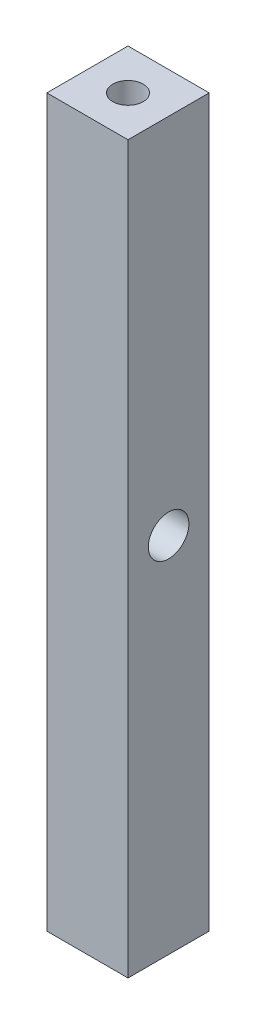
ISO-10303-21;
HEADER;
FILE_DESCRIPTION(('STEP AP214'),'2;1');
FILE_NAME('part.step','',(''),(''),'','','');
FILE_SCHEMA(('AUTOMOTIVE_DESIGN { 1 0 10303 214 1 1 1 1 }'));
ENDSEC;
DATA;
#1=APPLICATION_CONTEXT('core data for automotive mechanical design processes');
#2=APPLICATION_PROTOCOL_DEFINITION('international standard','automotive_design',2000,#1);
#3=PRODUCT_CONTEXT('',#1,'mechanical');
#4=PRODUCT('Part','Part','',(#3));
#5=PRODUCT_RELATED_PRODUCT_CATEGORY('part','',(#4));
#6=PRODUCT_DEFINITION_FORMATION('','',#4);
#7=PRODUCT_DEFINITION_CONTEXT('part definition',#1,'design');
#8=PRODUCT_DEFINITION('design','',#6,#7);
#9=PRODUCT_DEFINITION_SHAPE('','',#8);
#10=(LENGTH_UNIT() NAMED_UNIT(*) SI_UNIT(.MILLI.,.METRE.));
#11=(NAMED_UNIT(*) PLANE_ANGLE_UNIT() SI_UNIT($,.RADIAN.));
#12=(NAMED_UNIT(*) SI_UNIT($,.STERADIAN.) SOLID_ANGLE_UNIT());
#13=UNCERTAINTY_MEASURE_WITH_UNIT(LENGTH_MEASURE(1.E-05),#10,'distance_accuracy_value','');
#14=(GEOMETRIC_REPRESENTATION_CONTEXT(3) GLOBAL_UNCERTAINTY_ASSIGNED_CONTEXT((#13)) GLOBAL_UNIT_ASSIGNED_CONTEXT((#10,
#11,#12)) REPRESENTATION_CONTEXT('',''));
#15=CARTESIAN_POINT('',(0.,0.,0.));
#16=DIRECTION('',(0.,0.,1.));
#17=DIRECTION('',(1.,0.,0.));
#18=AXIS2_PLACEMENT_3D('',#15,#16,#17);
#19=CARTESIAN_POINT('',(0.,71.54,0.));
#20=DIRECTION('',(0.,-1.,0.));
#21=DIRECTION('',(0.,0.,-1.));
#22=AXIS2_PLACEMENT_3D('',#19,#20,#21);
#23=CYLINDRICAL_SURFACE('',#22,1.5);
#24=CARTESIAN_POINT('',(0.,37.0928756555323,-1.5));
#25=CARTESIAN_POINT('',(0.0699974234256297,37.092891900441,-1.49999219049447));
#26=CARTESIAN_POINT('',(0.140045834311919,37.0985636661542,-1.4950410907442));
#27=CARTESIAN_POINT('',(0.277329856209481,37.119906440328,-1.47578333210409));
#28=CARTESIAN_POINT('',(0.344556445019509,37.1356072516867,-1.46144878565587));
#29=CARTESIAN_POINT('',(0.473579846738376,37.1737512791687,-1.42483838991846));
#30=CARTESIAN_POINT('',(0.535438776762464,37.1960984824481,-1.40267483444956));
#31=CARTESIAN_POINT('',(0.654345454445194,37.2448645503127,-1.35130655299363));
#32=CARTESIAN_POINT('',(0.711393782469219,37.2712829226493,-1.3221026780169));
#33=CARTESIAN_POINT('',(0.832112796316593,37.3317731296115,-1.25039909811054));
#34=CARTESIAN_POINT('',(0.894667934226476,37.3662890400979,-1.20639573950363));
#35=CARTESIAN_POINT('',(1.01252546624227,37.4352116409638,-1.10933596759308));
#36=CARTESIAN_POINT('',(1.06781696482027,37.4696180933988,-1.05626622282799));
#37=CARTESIAN_POINT('',(1.18085873865547,37.5426258243625,-0.929610192252512));
#38=CARTESIAN_POINT('',(1.23680596671986,37.5806492122976,-0.854047289142161));
#39=CARTESIAN_POINT('',(1.33462220828284,37.6488280975163,-0.691189714821937));
#40=CARTESIAN_POINT('',(1.37652429746881,37.6790020418011,-0.603923293836164));
#41=CARTESIAN_POINT('',(1.43320768590294,37.7203425899025,-0.447869023983641));
#42=CARTESIAN_POINT('',(1.45235709597847,37.7344971092101,-0.381446049692532));
#43=CARTESIAN_POINT('',(1.48139011599675,37.7560563593756,-0.245552609316538));
#44=CARTESIAN_POINT('',(1.49128177610674,37.7634669543236,-0.176084845995165));
#45=CARTESIAN_POINT('',(1.50122173386249,37.7709137557809,-0.0358650926220234));
#46=CARTESIAN_POINT('',(1.50124445437644,37.770930800575,0.034889759118643));
#47=CARTESIAN_POINT('',(1.49138206321971,37.7635420650307,0.17531615667404));
#48=CARTESIAN_POINT('',(1.48149465709186,37.7561345657134,0.244987447822231));
#49=CARTESIAN_POINT('',(1.45291894941013,37.7349137794441,0.378889193792655));
#50=CARTESIAN_POINT('',(1.43454367361292,37.7213285776568,0.443224268236298));
#51=CARTESIAN_POINT('',(1.39000435781776,37.6888227865702,0.567680485046399));
#52=CARTESIAN_POINT('',(1.36383861948684,37.6699010339419,0.627800705033638));
#53=CARTESIAN_POINT('',(1.30147038485468,37.625610459845,0.749216921864733));
#54=CARTESIAN_POINT('',(1.26448790338124,37.599765406081,0.8099353847136));
#55=CARTESIAN_POINT('',(1.18326629602949,37.5446070248374,0.924567250548286));
#56=CARTESIAN_POINT('',(1.1390209863001,37.5152907478045,0.978474784621223));
#57=CARTESIAN_POINT('',(1.03477665117906,37.4489376587236,1.08908204283329));
#58=CARTESIAN_POINT('',(0.973390789973603,37.4115165586637,1.14424493004784));
#59=CARTESIAN_POINT('',(0.842165416378056,37.3372595828377,1.24400875556228));
#60=CARTESIAN_POINT('',(0.772321900474936,37.3004239936352,1.28860466211477));
#61=CARTESIAN_POINT('',(0.63901812975437,37.2381942599916,1.35873206411601));
#62=CARTESIAN_POINT('',(0.577012954699348,37.2119759978998,1.38628866868103));
#63=CARTESIAN_POINT('',(0.447934718580617,37.1653674125739,1.43319397108784));
#64=CARTESIAN_POINT('',(0.380873520309632,37.1449639532051,1.45256121808259));
#65=CARTESIAN_POINT('',(0.256313056001678,37.1164005062023,1.4790238535067));
#66=CARTESIAN_POINT('',(0.199552917883139,37.1066153955687,1.48779069496582));
#67=CARTESIAN_POINT('',(0.0846445338261732,37.0943558843833,1.49871760619789));
#68=CARTESIAN_POINT('',(0.0264981600971781,37.0918721305831,1.50088612873266));
#69=CARTESIAN_POINT('',(-0.0894789917333987,37.094628687905,1.49845270115552));
#70=CARTESIAN_POINT('',(-0.147309645809673,37.0998718420716,1.4938482589949));
#71=CARTESIAN_POINT('',(-0.261076152442872,37.1172121877505,1.4782252727197));
#72=CARTESIAN_POINT('',(-0.317008597948103,37.1293210772735,1.46719578056394));
#73=CARTESIAN_POINT('',(-0.446338044938872,37.164277582878,1.43413959562387));
#74=CARTESIAN_POINT('',(-0.518435953915031,37.1894482369731,1.40954189769242));
#75=CARTESIAN_POINT('',(-0.656307663640117,37.2453786107998,1.35088877838435));
#76=CARTESIAN_POINT('',(-0.722069517294748,37.2761485847723,1.31681594335477));
#77=CARTESIAN_POINT('',(-0.849349008048122,37.3410828237565,1.23869774116696));
#78=CARTESIAN_POINT('',(-0.910632876218258,37.3753288384605,1.19434110060341));
#79=CARTESIAN_POINT('',(-1.02600209636125,37.4434750627236,1.09682562914592));
#80=CARTESIAN_POINT('',(-1.08008392798894,37.4773750957467,1.04366252194463));
#81=CARTESIAN_POINT('',(-1.19127699162937,37.5496022262353,0.916234513829621));
#82=CARTESIAN_POINT('',(-1.2464752388576,37.5872817416536,0.839896270946857));
#83=CARTESIAN_POINT('',(-1.34262073345087,37.6545310476983,0.675551612651268));
#84=CARTESIAN_POINT('',(-1.38359882458129,37.6841183605228,0.587571029974851));
#85=CARTESIAN_POINT('',(-1.43843799144687,37.7241940640238,0.430755661496907));
#86=CARTESIAN_POINT('',(-1.45675679327544,37.7377547802964,0.364250057327467));
#87=CARTESIAN_POINT('',(-1.48412879630752,37.7581026558912,0.228364464964346));
#88=CARTESIAN_POINT('',(-1.49319028154851,37.7648958710696,0.158987104561938));
#89=CARTESIAN_POINT('',(-1.5015163909286,37.7711356671706,0.0191476059403946));
#90=CARTESIAN_POINT('',(-1.50075801734824,37.7705650021891,-0.0513166925870918));
#91=CARTESIAN_POINT('',(-1.48943900869876,37.7620880324381,-0.191009011030085));
#92=CARTESIAN_POINT('',(-1.47887576229252,37.7541797734435,-0.260236696591293));
#93=CARTESIAN_POINT('',(-1.44902508383276,37.732034009252,-0.393521935254976));
#94=CARTESIAN_POINT('',(-1.42999981867845,37.7179869079288,-0.457671236511445));
#95=CARTESIAN_POINT('',(-1.38421193438106,37.6846272057514,-0.581661343097392));
#96=CARTESIAN_POINT('',(-1.35744766016908,37.6653134786239,-0.641501223388818));
#97=CARTESIAN_POINT('',(-1.29372206240403,37.6201764221064,-0.762547698766816));
#98=CARTESIAN_POINT('',(-1.25594906864041,37.5938635270758,-0.823141236713421));
#99=CARTESIAN_POINT('',(-1.17313355944578,37.5378550607572,-0.937414811724218));
#100=CARTESIAN_POINT('',(-1.12808436271395,37.5081563879566,-0.991088412383377));
#101=CARTESIAN_POINT('',(-1.0219946334392,37.4410635304211,-1.10112380660681));
#102=CARTESIAN_POINT('',(-0.95955360056009,37.403309225047,-1.15591691541996));
#103=CARTESIAN_POINT('',(-0.826131928100119,37.3286608246333,-1.2547525342935));
#104=CARTESIAN_POINT('',(-0.75514817396343,37.2917670492189,-1.29879110556729));
#105=CARTESIAN_POINT('',(-0.621116749409686,37.2304960144928,-1.36695971301455));
#106=CARTESIAN_POINT('',(-0.559665017293434,37.2051362500764,-1.39333526337998));
#107=CARTESIAN_POINT('',(-0.431917086944111,37.1603256465123,-1.43805398028599));
#108=CARTESIAN_POINT('',(-0.365634308404542,37.140859158997,-1.45641847678344));
#109=CARTESIAN_POINT('',(-0.249211780403065,37.1153242338326,-1.4799705775638));
#110=CARTESIAN_POINT('',(-0.200032928709532,37.1070013026568,-1.48744249026866));
#111=CARTESIAN_POINT('',(-0.100577666966344,37.0957729539246,-1.49745839072448));
#112=CARTESIAN_POINT('',(-0.0503019990562727,37.0928639815115,-1.50000561211714));
#113=CARTESIAN_POINT('',(0.,37.0928756555323,-1.5));
#114=B_SPLINE_CURVE_WITH_KNOTS('',3,(#24,#25,#26,#27,#28,#29,#30,#31,#32,#33,#34,#35,#36,#37,
#38,#39,#40,#41,#42,#43,#44,#45,#46,#47,#48,#49,#50,#51,#52,#53,#54,#55,#56,#57,#58,#59,#60,#61,
#62,#63,#64,#65,#66,#67,#68,#69,#70,#71,#72,#73,#74,#75,#76,#77,#78,#79,#80,#81,#82,#83,#84,#85,
#86,#87,#88,#89,#90,#91,#92,#93,#94,#95,#96,#97,#98,#99,#100,#101,#102,#103,#104,#105,#106,#107,
#108,#109,#110,#111,#112,#113),.UNSPECIFIED.,.T.,.F.,(4,2,2,2,2,2,2,2,2,2,2,2,2,2,2,2,2,2,2,2,2,
2,2,2,2,2,2,2,2,2,2,2,2,2,2,2,2,2,2,2,2,2,2,2,4),(0.,0.209731776684491,0.420089722582995,
0.627545385620137,0.834975984672346,1.08585208691168,1.33710031031849,1.63964848103538,
1.94147907444963,2.15227725277555,2.36289195870711,2.57405250727807,2.78526195641288,
2.9892375589505,3.19325766108669,3.41936844116894,3.64567274887663,3.91649517204702,
4.18744629647933,4.40499409477197,4.62204646613006,4.79608005545901,4.96989060538193,
5.14376512326213,5.31793678696019,5.55730028202398,5.79710662639151,6.0454320909006,
6.29387849446618,6.59652499511463,6.89851088586565,7.10852896194427,7.31835893539181,
7.52868041101044,7.73905791773945,7.94332812691912,8.14764205379333,8.37510052489611,
8.60276905744645,8.87547580578156,9.14828228208532,9.36218279640836,9.57551025772699,
9.72632812073766,9.87704692032409),.UNSPECIFIED.);
#115=CARTESIAN_POINT('',(0.,37.0928756555323,-1.5));
#116=VERTEX_POINT('',#115);
#117=EDGE_CURVE('E146',#116,#116,#114,.T.);
#118=ORIENTED_EDGE('',*,*,#117,.T.);
#119=EDGE_LOOP('',(#118));
#120=FACE_BOUND('',#119,.T.);
#121=CARTESIAN_POINT('',(0.,71.54,0.));
#122=DIRECTION('',(0.,1.,0.));
#123=DIRECTION('',(0.,0.,1.));
#124=AXIS2_PLACEMENT_3D('',#121,#122,#123);
#125=CIRCLE('',#124,1.5);
#126=CARTESIAN_POINT('',(0.,71.54,1.5));
#127=VERTEX_POINT('',#126);
#128=EDGE_CURVE('E116',#127,#127,#125,.T.);
#129=ORIENTED_EDGE('',*,*,#128,.T.);
#130=EDGE_LOOP('',(#129));
#131=FACE_BOUND('',#130,.T.);
#132=ADVANCED_FACE('F42',(#120,#131),#23,.F.);
#133=CARTESIAN_POINT('',(0.,71.54,0.));
#134=DIRECTION('',(0.,-1.,0.));
#135=DIRECTION('',(0.,0.,-1.));
#136=AXIS2_PLACEMENT_3D('',#133,#134,#135);
#137=PLANE('',#136);
#138=DIRECTION('',(0.,0.,-1.));
#139=VECTOR('',#138,1.);
#140=CARTESIAN_POINT('',(4.,71.54,4.));
#141=LINE('',#140,#139);
#142=CARTESIAN_POINT('',(4.,71.54,4.));
#143=VERTEX_POINT('',#142);
#144=CARTESIAN_POINT('',(4.,71.54,-4.));
#145=VERTEX_POINT('',#144);
#146=EDGE_CURVE('E96',#143,#145,#141,.T.);
#147=ORIENTED_EDGE('',*,*,#146,.T.);
#148=DIRECTION('',(-1.,0.,0.));
#149=VECTOR('',#148,1.);
#150=CARTESIAN_POINT('',(-4.,71.54,-4.));
#151=LINE('',#150,#149);
#152=CARTESIAN_POINT('',(-4.,71.54,-4.));
#153=VERTEX_POINT('',#152);
#154=EDGE_CURVE('E90',#145,#153,#151,.T.);
#155=ORIENTED_EDGE('',*,*,#154,.T.);
#156=DIRECTION('',(0.,0.,1.));
#157=VECTOR('',#156,1.);
#158=CARTESIAN_POINT('',(-4.,71.54,4.));
#159=LINE('',#158,#157);
#160=CARTESIAN_POINT('',(-4.,71.54,4.));
#161=VERTEX_POINT('',#160);
#162=EDGE_CURVE('E94',#153,#161,#159,.T.);
#163=ORIENTED_EDGE('',*,*,#162,.T.);
#164=DIRECTION('',(1.,0.,0.));
#165=VECTOR('',#164,1.);
#166=CARTESIAN_POINT('',(-4.,71.54,4.));
#167=LINE('',#166,#165);
#168=EDGE_CURVE('E60',#161,#143,#167,.T.);
#169=ORIENTED_EDGE('',*,*,#168,.T.);
#170=EDGE_LOOP('',(#147,#155,#163,#169));
#171=FACE_BOUND('',#170,.T.);
#172=ORIENTED_EDGE('',*,*,#128,.F.);
#173=EDGE_LOOP('',(#172));
#174=FACE_BOUND('',#173,.T.);
#175=ADVANCED_FACE('F91',(#171,#174),#137,.F.);
#176=CARTESIAN_POINT('',(0.,0.,0.));
#177=DIRECTION('',(0.,-1.,0.));
#178=DIRECTION('',(0.,0.,-1.));
#179=AXIS2_PLACEMENT_3D('',#176,#177,#178);
#180=PLANE('',#179);
#181=DIRECTION('',(0.,0.,-1.));
#182=VECTOR('',#181,1.);
#183=CARTESIAN_POINT('',(4.,0.,4.));
#184=LINE('',#183,#182);
#185=CARTESIAN_POINT('',(4.,0.,4.));
#186=VERTEX_POINT('',#185);
#187=CARTESIAN_POINT('',(4.,0.,-4.));
#188=VERTEX_POINT('',#187);
#189=EDGE_CURVE('E112',#186,#188,#184,.T.);
#190=ORIENTED_EDGE('',*,*,#189,.F.);
#191=DIRECTION('',(1.,0.,0.));
#192=VECTOR('',#191,1.);
#193=CARTESIAN_POINT('',(-4.,0.,4.));
#194=LINE('',#193,#192);
#195=CARTESIAN_POINT('',(-4.,0.,4.));
#196=VERTEX_POINT('',#195);
#197=EDGE_CURVE('E83',#196,#186,#194,.T.);
#198=ORIENTED_EDGE('',*,*,#197,.F.);
#199=DIRECTION('',(0.,0.,1.));
#200=VECTOR('',#199,1.);
#201=CARTESIAN_POINT('',(-4.,0.,4.));
#202=LINE('',#201,#200);
#203=CARTESIAN_POINT('',(-4.,0.,-4.));
#204=VERTEX_POINT('',#203);
#205=EDGE_CURVE('E77',#204,#196,#202,.T.);
#206=ORIENTED_EDGE('',*,*,#205,.F.);
#207=DIRECTION('',(-1.,0.,0.));
#208=VECTOR('',#207,1.);
#209=CARTESIAN_POINT('',(-4.,0.,-4.));
#210=LINE('',#209,#208);
#211=EDGE_CURVE('E101',#188,#204,#210,.T.);
#212=ORIENTED_EDGE('',*,*,#211,.F.);
#213=EDGE_LOOP('',(#190,#198,#206,#212));
#214=FACE_BOUND('',#213,.T.);
#215=CARTESIAN_POINT('',(0.,0.,0.));
#216=DIRECTION('',(0.,1.,0.));
#217=DIRECTION('',(0.,0.,1.));
#218=AXIS2_PLACEMENT_3D('',#215,#216,#217);
#219=CIRCLE('',#218,1.5);
#220=CARTESIAN_POINT('',(0.,0.,1.5));
#221=VERTEX_POINT('',#220);
#222=EDGE_CURVE('E134',#221,#221,#219,.T.);
#223=ORIENTED_EDGE('',*,*,#222,.T.);
#224=EDGE_LOOP('',(#223));
#225=FACE_BOUND('',#224,.T.);
#226=ADVANCED_FACE('F129',(#214,#225),#180,.T.);
#227=CARTESIAN_POINT('',(4.,71.54,4.));
#228=DIRECTION('',(-1.,0.,0.));
#229=DIRECTION('',(0.,0.,1.));
#230=AXIS2_PLACEMENT_3D('',#227,#228,#229);
#231=PLANE('',#230);
#232=CARTESIAN_POINT('',(4.,35.77,0.));
#233=DIRECTION('',(1.,0.,0.));
#234=DIRECTION('',(0.,0.,-1.));
#235=AXIS2_PLACEMENT_3D('',#232,#233,#234);
#236=CIRCLE('',#235,2.);
#237=CARTESIAN_POINT('',(4.,35.77,-2.));
#238=VERTEX_POINT('',#237);
#239=EDGE_CURVE('E145',#238,#238,#236,.T.);
#240=ORIENTED_EDGE('',*,*,#239,.F.);
#241=EDGE_LOOP('',(#240));
#242=FACE_BOUND('',#241,.T.);
#243=ORIENTED_EDGE('',*,*,#189,.T.);
#244=DIRECTION('',(0.,-1.,0.));
#245=VECTOR('',#244,1.);
#246=CARTESIAN_POINT('',(4.,71.54,-4.));
#247=LINE('',#246,#245);
#248=EDGE_CURVE('E11',#145,#188,#247,.T.);
#249=ORIENTED_EDGE('',*,*,#248,.F.);
#250=ORIENTED_EDGE('',*,*,#146,.F.);
#251=DIRECTION('',(0.,-1.,0.));
#252=VECTOR('',#251,1.);
#253=CARTESIAN_POINT('',(4.,71.54,4.));
#254=LINE('',#253,#252);
#255=EDGE_CURVE('E108',#143,#186,#254,.T.);
#256=ORIENTED_EDGE('',*,*,#255,.T.);
#257=EDGE_LOOP('',(#243,#249,#250,#256));
#258=FACE_BOUND('',#257,.T.);
#259=ADVANCED_FACE('F44',(#242,#258),#231,.F.);
#260=CARTESIAN_POINT('',(-4.,71.54,-4.));
#261=DIRECTION('',(0.,0.,1.));
#262=DIRECTION('',(1.,0.,0.));
#263=AXIS2_PLACEMENT_3D('',#260,#261,#262);
#264=PLANE('',#263);
#265=ORIENTED_EDGE('',*,*,#211,.T.);
#266=DIRECTION('',(0.,-1.,0.));
#267=VECTOR('',#266,1.);
#268=CARTESIAN_POINT('',(-4.,71.54,-4.));
#269=LINE('',#268,#267);
#270=EDGE_CURVE('E52',#153,#204,#269,.T.);
#271=ORIENTED_EDGE('',*,*,#270,.F.);
#272=ORIENTED_EDGE('',*,*,#154,.F.);
#273=ORIENTED_EDGE('',*,*,#248,.T.);
#274=EDGE_LOOP('',(#265,#271,#272,#273));
#275=FACE_BOUND('',#274,.T.);
#276=ADVANCED_FACE('F100',(#275),#264,.F.);
#277=CARTESIAN_POINT('',(-4.,71.54,4.));
#278=DIRECTION('',(1.,0.,0.));
#279=DIRECTION('',(0.,0.,-1.));
#280=AXIS2_PLACEMENT_3D('',#277,#278,#279);
#281=PLANE('',#280);
#282=CARTESIAN_POINT('',(-4.,35.77,0.));
#283=DIRECTION('',(1.,0.,0.));
#284=DIRECTION('',(0.,0.,-1.));
#285=AXIS2_PLACEMENT_3D('',#282,#283,#284);
#286=CIRCLE('',#285,2.);
#287=CARTESIAN_POINT('',(-4.,35.77,-2.));
#288=VERTEX_POINT('',#287);
#289=EDGE_CURVE('E138',#288,#288,#286,.F.);
#290=ORIENTED_EDGE('',*,*,#289,.F.);
#291=EDGE_LOOP('',(#290));
#292=FACE_BOUND('',#291,.T.);
#293=ORIENTED_EDGE('',*,*,#205,.T.);
#294=DIRECTION('',(0.,-1.,0.));
#295=VECTOR('',#294,1.);
#296=CARTESIAN_POINT('',(-4.,71.54,4.));
#297=LINE('',#296,#295);
#298=EDGE_CURVE('E103',#161,#196,#297,.T.);
#299=ORIENTED_EDGE('',*,*,#298,.F.);
#300=ORIENTED_EDGE('',*,*,#162,.F.);
#301=ORIENTED_EDGE('',*,*,#270,.T.);
#302=EDGE_LOOP('',(#293,#299,#300,#301));
#303=FACE_BOUND('',#302,.T.);
#304=ADVANCED_FACE('F104',(#292,#303),#281,.F.);
#305=CARTESIAN_POINT('',(-4.,71.54,4.));
#306=DIRECTION('',(0.,0.,-1.));
#307=DIRECTION('',(-1.,0.,0.));
#308=AXIS2_PLACEMENT_3D('',#305,#306,#307);
#309=PLANE('',#308);
#310=ORIENTED_EDGE('',*,*,#197,.T.);
#311=ORIENTED_EDGE('',*,*,#255,.F.);
#312=ORIENTED_EDGE('',*,*,#168,.F.);
#313=ORIENTED_EDGE('',*,*,#298,.T.);
#314=EDGE_LOOP('',(#310,#311,#312,#313));
#315=FACE_BOUND('',#314,.T.);
#316=ADVANCED_FACE('F126',(#315),#309,.F.);
#317=CARTESIAN_POINT('',(0.,34.4471243444677,-1.5));
#318=CARTESIAN_POINT('',(-0.0699974234256297,34.4471080995591,-1.49999219049447));
#319=CARTESIAN_POINT('',(-0.140045834311919,34.4414363338458,-1.4950410907442));
#320=CARTESIAN_POINT('',(-0.27732985620948,34.420093559672,-1.47578333210409));
#321=CARTESIAN_POINT('',(-0.344556445019509,34.4043927483133,-1.46144878565587));
#322=CARTESIAN_POINT('',(-0.473579846738378,34.3662487208313,-1.42483838991846));
#323=CARTESIAN_POINT('',(-0.535438776762466,34.3439015175519,-1.40267483444956));
#324=CARTESIAN_POINT('',(-0.654345454445196,34.2951354496873,-1.35130655299363));
#325=CARTESIAN_POINT('',(-0.71139378246922,34.2687170773507,-1.3221026780169));
#326=CARTESIAN_POINT('',(-0.832112796316593,34.2082268703885,-1.25039909811054));
#327=CARTESIAN_POINT('',(-0.894667934226476,34.1737109599021,-1.20639573950363));
#328=CARTESIAN_POINT('',(-1.01252546624227,34.1047883590362,-1.10933596759308));
#329=CARTESIAN_POINT('',(-1.06781696482027,34.0703819066012,-1.05626622282799));
#330=CARTESIAN_POINT('',(-1.18085873865547,33.9973741756375,-0.929610192252512));
#331=CARTESIAN_POINT('',(-1.23680596671986,33.9593507877024,-0.854047289142161));
#332=CARTESIAN_POINT('',(-1.33462220828284,33.8911719024837,-0.691189714821937));
#333=CARTESIAN_POINT('',(-1.37652429746881,33.8609979581989,-0.603923293836164));
#334=CARTESIAN_POINT('',(-1.43320768590294,33.8196574100975,-0.447869023983641));
#335=CARTESIAN_POINT('',(-1.45235709597847,33.8055028907899,-0.381446049692532));
#336=CARTESIAN_POINT('',(-1.48139011599675,33.7839436406245,-0.245552609316538));
#337=CARTESIAN_POINT('',(-1.49128177610674,33.7765330456764,-0.176084845995165));
#338=CARTESIAN_POINT('',(-1.50122173386249,33.7690862442191,-0.0358650926220234));
#339=CARTESIAN_POINT('',(-1.50124445437644,33.7690691994251,0.034889759118643));
#340=CARTESIAN_POINT('',(-1.49138206321971,33.7764579349694,0.17531615667404));
#341=CARTESIAN_POINT('',(-1.48149465709186,33.7838654342866,0.244987447822231));
#342=CARTESIAN_POINT('',(-1.45291894941013,33.8050862205559,0.378889193792655));
#343=CARTESIAN_POINT('',(-1.43454367361292,33.8186714223432,0.443224268236298));
#344=CARTESIAN_POINT('',(-1.39000435781776,33.8511772134298,0.567680485046399));
#345=CARTESIAN_POINT('',(-1.36383861948684,33.8700989660581,0.627800705033638));
#346=CARTESIAN_POINT('',(-1.30147038485468,33.914389540155,0.749216921864733));
#347=CARTESIAN_POINT('',(-1.26448790338124,33.940234593919,0.8099353847136));
#348=CARTESIAN_POINT('',(-1.18326629602949,33.9953929751626,0.924567250548286));
#349=CARTESIAN_POINT('',(-1.1390209863001,34.0247092521955,0.978474784621223));
#350=CARTESIAN_POINT('',(-1.03477665117906,34.0910623412764,1.08908204283329));
#351=CARTESIAN_POINT('',(-0.973390789973602,34.1284834413363,1.14424493004784));
#352=CARTESIAN_POINT('',(-0.842165416378055,34.2027404171623,1.24400875556228));
#353=CARTESIAN_POINT('',(-0.772321900474936,34.2395760063648,1.28860466211477));
#354=CARTESIAN_POINT('',(-0.63901812975437,34.3018057400084,1.35873206411601));
#355=CARTESIAN_POINT('',(-0.577012954699348,34.3280240021002,1.38628866868103));
#356=CARTESIAN_POINT('',(-0.447934718580617,34.3746325874261,1.43319397108784));
#357=CARTESIAN_POINT('',(-0.380873520309632,34.3950360467949,1.45256121808259));
#358=CARTESIAN_POINT('',(-0.256313056001678,34.4235994937977,1.4790238535067));
#359=CARTESIAN_POINT('',(-0.199552917883139,34.4333846044313,1.48779069496582));
#360=CARTESIAN_POINT('',(-0.0846445338261732,34.4456441156167,1.49871760619789));
#361=CARTESIAN_POINT('',(-0.0264981600971781,34.4481278694169,1.50088612873266));
#362=CARTESIAN_POINT('',(0.0894789917333987,34.445371312095,1.49845270115552));
#363=CARTESIAN_POINT('',(0.147309645809673,34.4401281579284,1.4938482589949));
#364=CARTESIAN_POINT('',(0.261076152442872,34.4227878122495,1.4782252727197));
#365=CARTESIAN_POINT('',(0.317008597948103,34.4106789227266,1.46719578056394));
#366=CARTESIAN_POINT('',(0.446338044938872,34.375722417122,1.43413959562387));
#367=CARTESIAN_POINT('',(0.518435953915031,34.3505517630269,1.40954189769242));
#368=CARTESIAN_POINT('',(0.656307663640117,34.2946213892003,1.35088877838435));
#369=CARTESIAN_POINT('',(0.722069517294748,34.2638514152277,1.31681594335477));
#370=CARTESIAN_POINT('',(0.849349008048122,34.1989171762435,1.23869774116696));
#371=CARTESIAN_POINT('',(0.910632876218258,34.1646711615396,1.19434110060341));
#372=CARTESIAN_POINT('',(1.02600209636125,34.0965249372764,1.09682562914592));
#373=CARTESIAN_POINT('',(1.08008392798894,34.0626249042534,1.04366252194463));
#374=CARTESIAN_POINT('',(1.19127699162937,33.9903977737647,0.916234513829621));
#375=CARTESIAN_POINT('',(1.2464752388576,33.9527182583464,0.839896270946856));
#376=CARTESIAN_POINT('',(1.34262073345087,33.8854689523017,0.675551612651267));
#377=CARTESIAN_POINT('',(1.38359882458129,33.8558816394772,0.58757102997485));
#378=CARTESIAN_POINT('',(1.43843799144687,33.8158059359762,0.430755661496909));
#379=CARTESIAN_POINT('',(1.45675679327544,33.8022452197036,0.36425005732747));
#380=CARTESIAN_POINT('',(1.48412879630752,33.7818973441088,0.228364464964349));
#381=CARTESIAN_POINT('',(1.49319028154851,33.7751041289304,0.158987104561939));
#382=CARTESIAN_POINT('',(1.5015163909286,33.7688643328294,0.0191476059403945));
#383=CARTESIAN_POINT('',(1.50075801734824,33.7694349978109,-0.0513166925870918));
#384=CARTESIAN_POINT('',(1.48943900869876,33.7779119675619,-0.191009011030085));
#385=CARTESIAN_POINT('',(1.47887576229252,33.7858202265565,-0.260236696591293));
#386=CARTESIAN_POINT('',(1.44902508383276,33.8079659907481,-0.393521935254976));
#387=CARTESIAN_POINT('',(1.42999981867845,33.8220130920712,-0.457671236511445));
#388=CARTESIAN_POINT('',(1.38421193438106,33.8553727942486,-0.581661343097392));
#389=CARTESIAN_POINT('',(1.35744766016908,33.8746865213761,-0.641501223388818));
#390=CARTESIAN_POINT('',(1.29372206240403,33.9198235778936,-0.762547698766816));
#391=CARTESIAN_POINT('',(1.25594906864041,33.9461364729242,-0.823141236713421));
#392=CARTESIAN_POINT('',(1.17313355944578,34.0021449392428,-0.937414811724218));
#393=CARTESIAN_POINT('',(1.12808436271395,34.0318436120434,-0.991088412383377));
#394=CARTESIAN_POINT('',(1.0219946334392,34.0989364695789,-1.10112380660681));
#395=CARTESIAN_POINT('',(0.95955360056009,34.136690774953,-1.15591691541996));
#396=CARTESIAN_POINT('',(0.826131928100119,34.2113391753667,-1.2547525342935));
#397=CARTESIAN_POINT('',(0.75514817396343,34.2482329507811,-1.29879110556729));
#398=CARTESIAN_POINT('',(0.621116749409686,34.3095039855072,-1.36695971301455));
#399=CARTESIAN_POINT('',(0.559665017293434,34.3348637499236,-1.39333526337998));
#400=CARTESIAN_POINT('',(0.431917086944111,34.3796743534877,-1.43805398028599));
#401=CARTESIAN_POINT('',(0.365634308404542,34.399140841003,-1.45641847678344));
#402=CARTESIAN_POINT('',(0.249211780403065,34.4246757661674,-1.4799705775638));
#403=CARTESIAN_POINT('',(0.200032928709532,34.4329986973432,-1.48744249026866));
#404=CARTESIAN_POINT('',(0.100577666966344,34.4442270460755,-1.49745839072448));
#405=CARTESIAN_POINT('',(0.0503019990562727,34.4471360184885,-1.50000561211714));
#406=CARTESIAN_POINT('',(0.,34.4471243444677,-1.5));
#407=B_SPLINE_CURVE_WITH_KNOTS('',3,(#317,#318,#319,#320,#321,#322,#323,#324,#325,#326,#327,
#328,#329,#330,#331,#332,#333,#334,#335,#336,#337,#338,#339,#340,#341,#342,#343,#344,#345,#346,
#347,#348,#349,#350,#351,#352,#353,#354,#355,#356,#357,#358,#359,#360,#361,#362,#363,#364,#365,
#366,#367,#368,#369,#370,#371,#372,#373,#374,#375,#376,#377,#378,#379,#380,#381,#382,#383,#384,
#385,#386,#387,#388,#389,#390,#391,#392,#393,#394,#395,#396,#397,#398,#399,#400,#401,#402,#403,
#404,#405,#406),.UNSPECIFIED.,.T.,.F.,(4,2,2,2,2,2,2,2,2,2,2,2,2,2,2,2,2,2,2,2,2,2,2,2,2,2,2,2,
2,2,2,2,2,2,2,2,2,2,2,2,2,2,2,2,4),(0.,0.209731776684491,0.420089722582995,0.627545385620141,
0.834975984672346,1.08585208691169,1.33710031031849,1.63964848103538,1.94147907444963,
2.15227725277555,2.36289195870711,2.57405250727807,2.78526195641288,2.9892375589505,
3.19325766108669,3.41936844116894,3.64567274887663,3.91649517204702,4.18744629647933,
4.40499409477197,4.62204646613006,4.79608005545901,4.96989060538193,5.14376512326213,
5.31793678696019,5.55730028202398,5.79710662639151,6.0454320909006,6.29387849446618,
6.59652499511463,6.89851088586565,7.10852896194427,7.31835893539181,7.52868041101044,
7.73905791773945,7.94332812691912,8.14764205379333,8.37510052489611,8.60276905744645,
8.87547580578156,9.14828228208532,9.36218279640836,9.57551025772699,9.72632812073766,
9.87704692032409),.UNSPECIFIED.);
#408=CARTESIAN_POINT('',(0.,34.4471243444677,-1.5));
#409=VERTEX_POINT('',#408);
#410=EDGE_CURVE('E155',#409,#409,#407,.T.);
#411=ORIENTED_EDGE('',*,*,#410,.T.);
#412=EDGE_LOOP('',(#411));
#413=FACE_BOUND('',#412,.T.);
#414=ORIENTED_EDGE('',*,*,#222,.F.);
#415=EDGE_LOOP('',(#414));
#416=FACE_BOUND('',#415,.T.);
#417=ADVANCED_FACE('F166',(#413,#416),#23,.F.);
#418=CARTESIAN_POINT('',(-4.001,35.77,0.));
#419=DIRECTION('',(1.,0.,0.));
#420=DIRECTION('',(0.,0.,-1.));
#421=AXIS2_PLACEMENT_3D('',#418,#419,#420);
#422=CYLINDRICAL_SURFACE('',#421,2.);
#423=ORIENTED_EDGE('',*,*,#239,.T.);
#424=EDGE_LOOP('',(#423));
#425=FACE_BOUND('',#424,.T.);
#426=ORIENTED_EDGE('',*,*,#410,.F.);
#427=EDGE_LOOP('',(#426));
#428=FACE_BOUND('',#427,.T.);
#429=ORIENTED_EDGE('',*,*,#117,.F.);
#430=EDGE_LOOP('',(#429));
#431=FACE_BOUND('',#430,.T.);
#432=ORIENTED_EDGE('',*,*,#289,.T.);
#433=EDGE_LOOP('',(#432));
#434=FACE_BOUND('',#433,.T.);
#435=ADVANCED_FACE('F160',(#425,#428,#431,#434),#422,.F.);
#436=CLOSED_SHELL('',(#132,#175,#226,#259,#276,#304,#316,#417,#435));
#437=MANIFOLD_SOLID_BREP('B2',#436);
#438=ADVANCED_BREP_SHAPE_REPRESENTATION('',(#18,#437),#14);
#439=SHAPE_DEFINITION_REPRESENTATION(#9,#438);
ENDSEC;
END-ISO-10303-21;
